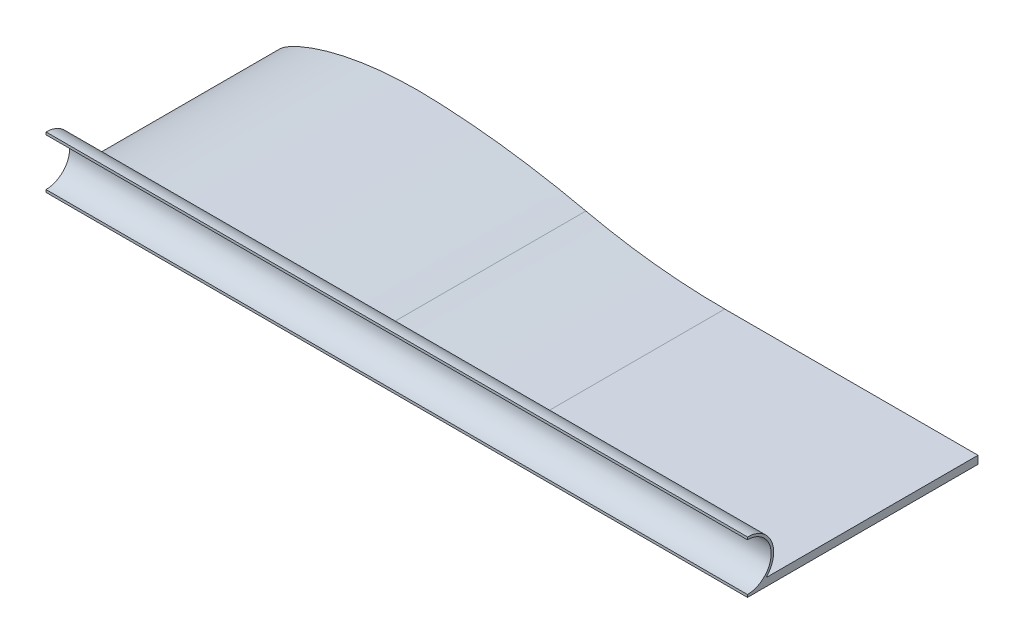
ISO-10303-21;
HEADER;
FILE_DESCRIPTION(('STEP AP214'),'2;1');
FILE_NAME('part.step','',(''),(''),'','','');
FILE_SCHEMA(('AUTOMOTIVE_DESIGN { 1 0 10303 214 1 1 1 1 }'));
ENDSEC;
DATA;
#1=APPLICATION_CONTEXT('core data for automotive mechanical design processes');
#2=APPLICATION_PROTOCOL_DEFINITION('international standard','automotive_design',2000,#1);
#3=PRODUCT_CONTEXT('',#1,'mechanical');
#4=PRODUCT('Part','Part','',(#3));
#5=PRODUCT_RELATED_PRODUCT_CATEGORY('part','',(#4));
#6=PRODUCT_DEFINITION_FORMATION('','',#4);
#7=PRODUCT_DEFINITION_CONTEXT('part definition',#1,'design');
#8=PRODUCT_DEFINITION('design','',#6,#7);
#9=PRODUCT_DEFINITION_SHAPE('','',#8);
#10=(LENGTH_UNIT() NAMED_UNIT(*) SI_UNIT(.MILLI.,.METRE.));
#11=(NAMED_UNIT(*) PLANE_ANGLE_UNIT() SI_UNIT($,.RADIAN.));
#12=(NAMED_UNIT(*) SI_UNIT($,.STERADIAN.) SOLID_ANGLE_UNIT());
#13=UNCERTAINTY_MEASURE_WITH_UNIT(LENGTH_MEASURE(1.E-05),#10,'distance_accuracy_value','');
#14=(GEOMETRIC_REPRESENTATION_CONTEXT(3) GLOBAL_UNCERTAINTY_ASSIGNED_CONTEXT((#13)) GLOBAL_UNIT_ASSIGNED_CONTEXT((#10,
#11,#12)) REPRESENTATION_CONTEXT('',''));
#15=CARTESIAN_POINT('',(0.,0.,0.));
#16=DIRECTION('',(0.,0.,1.));
#17=DIRECTION('',(1.,0.,0.));
#18=AXIS2_PLACEMENT_3D('',#15,#16,#17);
#19=CARTESIAN_POINT('',(0.,0.,185.42));
#20=DIRECTION('',(0.,0.,1.));
#21=DIRECTION('',(1.,0.,0.));
#22=AXIS2_PLACEMENT_3D('',#19,#20,#21);
#23=PLANE('',#22);
#24=DIRECTION('',(-1.,0.,0.));
#25=VECTOR('',#24,1.);
#26=CARTESIAN_POINT('',(563.88,36.4773533691905,185.42));
#27=LINE('',#26,#25);
#28=CARTESIAN_POINT('',(563.88,36.4773533691905,185.42));
#29=VERTEX_POINT('',#28);
#30=CARTESIAN_POINT('',(-0.366692026212409,36.4773533691905,185.42));
#31=VERTEX_POINT('',#30);
#32=EDGE_CURVE('E51',#29,#31,#27,.T.);
#33=ORIENTED_EDGE('',*,*,#32,.F.);
#34=DIRECTION('',(0.,1.,0.));
#35=VECTOR('',#34,1.);
#36=CARTESIAN_POINT('',(563.88,0.,185.42));
#37=LINE('',#36,#35);
#38=CARTESIAN_POINT('',(563.88,38.5093533691905,185.42));
#39=VERTEX_POINT('',#38);
#40=EDGE_CURVE('E174',#29,#39,#37,.T.);
#41=ORIENTED_EDGE('',*,*,#40,.T.);
#42=DIRECTION('',(-1.,0.,0.));
#43=VECTOR('',#42,1.);
#44=CARTESIAN_POINT('',(563.88,38.5093533691905,185.42));
#45=LINE('',#44,#43);
#46=CARTESIAN_POINT('',(-0.366692026212367,38.5093533691905,185.42));
#47=VERTEX_POINT('',#46);
#48=EDGE_CURVE('E210',#39,#47,#45,.T.);
#49=ORIENTED_EDGE('',*,*,#48,.T.);
#50=DIRECTION('',(0.,1.,0.));
#51=VECTOR('',#50,1.);
#52=CARTESIAN_POINT('',(-0.366692026212367,0.,185.42));
#53=LINE('',#52,#51);
#54=EDGE_CURVE('E221',#31,#47,#53,.T.);
#55=ORIENTED_EDGE('',*,*,#54,.F.);
#56=EDGE_LOOP('',(#33,#41,#49,#55));
#57=FACE_BOUND('',#56,.T.);
#58=ADVANCED_FACE('F35',(#57),#23,.T.);
#59=CARTESIAN_POINT('',(0.,2.69535336919036,185.42));
#60=DIRECTION('',(0.,-1.,0.));
#61=DIRECTION('',(1.,0.,0.));
#62=AXIS2_PLACEMENT_3D('',#59,#60,#61);
#63=PLANE('',#62);
#64=DIRECTION('',(-1.,0.,0.));
#65=VECTOR('',#64,1.);
#66=CARTESIAN_POINT('',(563.88,2.69535336919067,170.339585549462));
#67=LINE('',#66,#65);
#68=CARTESIAN_POINT('',(563.88,2.69535336919067,170.339585549462));
#69=VERTEX_POINT('',#68);
#70=CARTESIAN_POINT('',(360.180421151928,2.69535336919056,170.339585549462));
#71=VERTEX_POINT('',#70);
#72=EDGE_CURVE('E59',#69,#71,#67,.T.);
#73=ORIENTED_EDGE('',*,*,#72,.F.);
#74=DIRECTION('',(0.,0.,-1.));
#75=VECTOR('',#74,1.);
#76=CARTESIAN_POINT('',(563.88,2.69535336919067,185.42));
#77=LINE('',#76,#75);
#78=CARTESIAN_POINT('',(563.88,2.69535336919067,0.));
#79=VERTEX_POINT('',#78);
#80=EDGE_CURVE('E120',#69,#79,#77,.T.);
#81=ORIENTED_EDGE('',*,*,#80,.T.);
#82=DIRECTION('',(-1.,0.,0.));
#83=VECTOR('',#82,1.);
#84=CARTESIAN_POINT('',(0.,2.69535336919036,0.));
#85=LINE('',#84,#83);
#86=CARTESIAN_POINT('',(360.180421151928,2.69535336919056,0.));
#87=VERTEX_POINT('',#86);
#88=EDGE_CURVE('E112',#79,#87,#85,.T.);
#89=ORIENTED_EDGE('',*,*,#88,.T.);
#90=DIRECTION('',(0.,0.,1.));
#91=VECTOR('',#90,1.);
#92=CARTESIAN_POINT('',(360.180421151928,2.69535336919056,185.42));
#93=LINE('',#92,#91);
#94=EDGE_CURVE('E117',#87,#71,#93,.T.);
#95=ORIENTED_EDGE('',*,*,#94,.T.);
#96=EDGE_LOOP('',(#73,#81,#89,#95));
#97=FACE_BOUND('',#96,.T.);
#98=ADVANCED_FACE('F119',(#97),#63,.F.);
#99=CARTESIAN_POINT('',(304.8,0.,185.42));
#100=CARTESIAN_POINT('',(304.806765113415,0.0297936907438,185.42));
#101=CARTESIAN_POINT('',(303.042265442166,0.505757681104882,185.42));
#102=CARTESIAN_POINT('',(301.260699107524,1.13128828679422,185.42));
#103=CARTESIAN_POINT('',(296.859481645383,2.43138214292342,185.42));
#104=CARTESIAN_POINT('',(291.428347563501,4.05950750692163,185.42));
#105=CARTESIAN_POINT('',(284.271481229636,6.10623828707882,185.42));
#106=CARTESIAN_POINT('',(275.759062516084,8.44101190552645,185.42));
#107=CARTESIAN_POINT('',(265.867595029522,11.0139121726236,185.42));
#108=CARTESIAN_POINT('',(254.72828410266,13.7239516275996,185.42));
#109=CARTESIAN_POINT('',(242.45219776627,16.501342019607,185.42));
#110=CARTESIAN_POINT('',(229.161916522714,19.2494538440017,185.42));
#111=CARTESIAN_POINT('',(215.002240334106,21.8918598082205,185.42));
#112=CARTESIAN_POINT('',(200.122077246214,24.3476644337164,185.42));
#113=CARTESIAN_POINT('',(184.681833301631,26.5449418917091,185.42));
#114=CARTESIAN_POINT('',(168.851714947921,28.4233907056108,185.42));
#115=CARTESIAN_POINT('',(152.808183208541,29.930661937332,185.42));
#116=CARTESIAN_POINT('',(136.726583628561,31.0048710051825,185.42));
#117=CARTESIAN_POINT('',(120.705050439528,31.6889083800929,185.42));
#118=CARTESIAN_POINT('',(104.91367571592,31.6961733177902,185.42));
#119=CARTESIAN_POINT('',(89.5648924045714,30.8862286831657,185.42));
#120=CARTESIAN_POINT('',(74.9378034426248,29.3709102924395,185.42));
#121=CARTESIAN_POINT('',(61.2207309550213,27.2233169079844,185.42));
#122=CARTESIAN_POINT('',(48.5867513337238,24.5540455106148,185.42));
#123=CARTESIAN_POINT('',(37.1861333906392,21.5011014723962,185.42));
#124=CARTESIAN_POINT('',(27.1552746614983,18.1970778873359,185.42));
#125=CARTESIAN_POINT('',(18.5969283006425,14.8044671458805,185.42));
#126=CARTESIAN_POINT('',(11.6063717286755,11.4360388322654,185.42));
#127=CARTESIAN_POINT('',(6.20537461581932,8.26316028915888,185.42));
#128=CARTESIAN_POINT('',(2.4620711553724,5.3102193566351,185.42));
#129=CARTESIAN_POINT('',(0.172825892274397,2.71807809904705,185.42));
#130=CARTESIAN_POINT('',(-0.366692026212387,-0.106725709936372,185.42));
#131=CARTESIAN_POINT('',(1.61853864418734,-2.17519153343636,185.42));
#132=CARTESIAN_POINT('',(4.90312913802598,-3.1117877974165,185.42));
#133=CARTESIAN_POINT('',(9.54050066961738,-3.65904451106276,185.42));
#134=CARTESIAN_POINT('',(15.6223250235567,-3.68468011379504,185.42));
#135=CARTESIAN_POINT('',(23.0877165309997,-3.30949507157914,185.42));
#136=CARTESIAN_POINT('',(31.8617424793389,-2.56072504363965,185.42));
#137=CARTESIAN_POINT('',(41.8437098749915,-1.53618962834286,185.42));
#138=CARTESIAN_POINT('',(52.9319861205823,-0.324549042889645,185.42));
#139=CARTESIAN_POINT('',(65.0085126482625,0.982737612858198,185.42));
#140=CARTESIAN_POINT('',(77.9641225568185,2.27751163277432,185.42));
#141=CARTESIAN_POINT('',(91.6740314858693,3.44660128053989,185.42));
#142=CARTESIAN_POINT('',(106.020407657375,4.41212483885966,185.42));
#143=CARTESIAN_POINT('',(120.95534562256,5.05177624345621,185.42));
#144=CARTESIAN_POINT('',(136.33914130998,5.41029723383236,185.42));
#145=CARTESIAN_POINT('',(152.007716340095,5.72933017095042,185.42));
#146=CARTESIAN_POINT('',(167.715786189237,5.89135553497832,185.42));
#147=CARTESIAN_POINT('',(183.286749282816,5.90781947795733,185.42));
#148=CARTESIAN_POINT('',(198.553027184666,5.75950083301546,185.42));
#149=CARTESIAN_POINT('',(213.347799024157,5.45737661505621,185.42));
#150=CARTESIAN_POINT('',(227.508384673819,5.01338248731081,185.42));
#151=CARTESIAN_POINT('',(240.877077650288,4.45854649480439,185.42));
#152=CARTESIAN_POINT('',(253.302348041566,3.81956254234677,185.42));
#153=CARTESIAN_POINT('',(264.636493620716,3.14064435260617,185.42));
#154=CARTESIAN_POINT('',(274.759317931257,2.45167335072776,185.42));
#155=CARTESIAN_POINT('',(283.511762664263,1.80333800911344,185.42));
#156=CARTESIAN_POINT('',(290.902443864489,1.20739442477992,185.42));
#157=CARTESIAN_POINT('',(296.536660630331,0.742433739926797,185.42));
#158=CARTESIAN_POINT('',(301.097723541562,0.310240549260641,185.42));
#159=CARTESIAN_POINT('',(302.984341567181,0.206591885939164,185.42));
#160=CARTESIAN_POINT('',(304.793276654245,-0.0296097451566188,185.42));
#161=CARTESIAN_POINT('',(304.8,0.,185.42));
#162=B_SPLINE_CURVE_WITH_KNOTS('',3,(#99,#100,#101,#102,#103,#104,#105,#106,#107,#108,#109,#110,
#111,#112,#113,#114,#115,#116,#117,#118,#119,#120,#121,#122,#123,#124,#125,#126,#127,#128,#129,
#130,#131,#132,#133,#134,#135,#136,#137,#138,#139,#140,#141,#142,#143,#144,#145,#146,#147,#148,
#149,#150,#151,#152,#153,#154,#155,#156,#157,#158,#159,#160,#161),.UNSPECIFIED.,.T.,.F.,(4,1,1,
1,1,1,1,1,1,1,1,1,1,1,1,1,1,1,1,1,1,1,1,1,1,1,1,1,1,1,1,1,1,1,1,1,1,1,1,1,1,1,1,1,1,1,1,1,1,1,1,
1,1,1,1,1,1,1,1,1,4),(0.,0.00137455348322331,0.00548449728179396,0.0122733609908927,
0.021682195504866,0.0335806119079948,0.0478307427867091,0.0643059527211734,0.082777332043007,
0.103063756455997,0.124929016786915,0.148149110667858,0.172444694611559,0.197572105868171,
0.223268880537162,0.249227774933554,0.275186209349679,0.300900708934774,0.326462938278696,
0.351222485186767,0.374905858971967,0.397269706218861,0.418072413969665,0.437079533175026,
0.454093093767394,0.468919631578705,0.48139171235289,0.491447126518173,0.499023571234557,
0.504293734329401,0.507921918342,0.511539686153778,0.516780527527172,0.524216490268905,
0.533991629403711,0.546033957270731,0.560220284382465,0.576403357410148,0.594370816485922,
0.613951103581465,0.634916884969972,0.657088503485648,0.680229909573905,0.704175481107386,
0.72909036740664,0.754353775526935,0.779667752347888,0.804760119952374,0.829359338708984,
0.853208710008459,0.876041363199166,0.897604065496152,0.917662212410958,0.935969860405553,
0.952309787739252,0.966502759006892,0.978350082728452,0.987731492337842,0.994510920242662,
0.998633932979557,1.),.UNSPECIFIED.);
#163=DIRECTION('',(0.,0.,-1.));
#164=VECTOR('',#163,1.);
#165=SURFACE_OF_LINEAR_EXTRUSION('',#162,#164);
#166=CARTESIAN_POINT('',(248.468052168918,15.1306788652424,164.463473326362));
#167=CARTESIAN_POINT('',(247.099112764868,15.4393030736697,164.429668740607));
#168=CARTESIAN_POINT('',(245.729105769636,15.7439384634841,164.403164041799));
#169=CARTESIAN_POINT('',(242.98715958145,16.3451319217436,164.363636037673));
#170=CARTESIAN_POINT('',(241.615220436294,16.6416901864393,164.35061240452));
#171=CARTESIAN_POINT('',(238.869528993161,17.2266484245325,164.336926529534));
#172=CARTESIAN_POINT('',(237.495776672501,17.5150482948292,164.33626444385));
#173=CARTESIAN_POINT('',(234.746598439609,18.0837493381834,164.346301754495));
#174=CARTESIAN_POINT('',(233.371172479316,18.3640502726612,164.357001485173));
#175=CARTESIAN_POINT('',(230.618784230446,18.9165921609464,164.388845334103));
#176=CARTESIAN_POINT('',(229.241821898425,19.1888328805205,164.409989755566));
#177=CARTESIAN_POINT('',(226.478603793566,19.726789216564,164.462024055523));
#178=CARTESIAN_POINT('',(225.092340035387,19.9924584219975,164.492969163741));
#179=CARTESIAN_POINT('',(222.318490622957,20.5155577262323,164.563744839146));
#180=CARTESIAN_POINT('',(220.930904972023,20.7729878456534,164.603575384095));
#181=CARTESIAN_POINT('',(218.154524449685,21.279539448282,164.6913373582));
#182=CARTESIAN_POINT('',(216.765729621149,21.5286612146448,164.739268510944));
#183=CARTESIAN_POINT('',(213.987042349249,22.0185235511418,164.842475082088));
#184=CARTESIAN_POINT('',(212.597149995387,22.2592647444273,164.897749952956));
#185=CARTESIAN_POINT('',(209.816387956572,22.7323048063502,165.014913115282));
#186=CARTESIAN_POINT('',(208.425518412209,22.9646047056129,165.076800595724));
#187=CARTESIAN_POINT('',(203.687559953126,23.7412065742073,165.297593043582));
#188=CARTESIAN_POINT('',(200.337783470008,24.2652725829202,165.470632687059));
#189=CARTESIAN_POINT('',(193.632531070931,25.2637601399537,165.841313314402));
#190=CARTESIAN_POINT('',(190.277055644423,25.7381857522015,166.038952281482));
#191=CARTESIAN_POINT('',(183.55969327915,26.6370163802038,166.449579205512));
#192=CARTESIAN_POINT('',(180.197805254594,27.0614119848388,166.662570038189));
#193=CARTESIAN_POINT('',(175.150007571335,27.6597382817842,166.986320969196));
#194=CARTESIAN_POINT('',(173.466212297941,27.8528405361224,167.094972932367));
#195=CARTESIAN_POINT('',(170.097202157144,28.2261269124826,167.312436529626));
#196=CARTESIAN_POINT('',(168.411987294754,28.4063110799215,167.421248163152));
#197=CARTESIAN_POINT('',(165.038988742322,28.7536321459034,167.637760776665));
#198=CARTESIAN_POINT('',(163.351204086191,28.9207601574536,167.745460957575));
#199=CARTESIAN_POINT('',(159.974167283474,29.2413958652269,167.958151865315));
#200=CARTESIAN_POINT('',(158.284915137895,29.3949035707931,168.063142594003));
#201=CARTESIAN_POINT('',(155.749114612675,29.6147238866364,168.217478258039));
#202=CARTESIAN_POINT('',(154.903116246131,29.6862893189844,168.268422371533));
#203=CARTESIAN_POINT('',(153.21074882911,29.8258455257352,168.369031887208));
#204=CARTESIAN_POINT('',(152.364379778719,29.8938363009836,168.418697289692));
#205=CARTESIAN_POINT('',(149.824732837902,30.0924564399681,168.565533853266));
#206=CARTESIAN_POINT('',(148.130908282538,30.217734213109,168.660545791737));
#207=CARTESIAN_POINT('',(144.751165423032,30.4538681438089,168.843425691181));
#208=CARTESIAN_POINT('',(143.06525429601,30.5647991228659,168.931329738892));
#209=CARTESIAN_POINT('',(140.535497050165,30.7213018720438,169.057660941176));
#210=CARTESIAN_POINT('',(139.692091942403,30.7718207322848,169.098850724682));
#211=CARTESIAN_POINT('',(138.005003288557,30.8696319326728,169.179313659566));
#212=CARTESIAN_POINT('',(137.16131974225,30.9169242702306,169.218586809405));
#213=CARTESIAN_POINT('',(134.629336651477,31.0539885921684,169.33336991774));
#214=CARTESIAN_POINT('',(132.940628434751,31.1389155038115,169.405817240403));
#215=CARTESIAN_POINT('',(129.562002759082,31.2926329082601,169.538717575606));
#216=CARTESIAN_POINT('',(127.872085310089,31.3614235323552,169.599170685735));
#217=CARTESIAN_POINT('',(124.492561356265,31.4797032865283,169.704133434236));
#218=CARTESIAN_POINT('',(122.802955914516,31.5292095492614,169.748657221691));
#219=CARTESIAN_POINT('',(119.422806870303,31.6058021333441,169.81791558745));
#220=CARTESIAN_POINT('',(117.732263265494,31.6328883983902,169.842650116058));
#221=CARTESIAN_POINT('',(114.352868206746,31.6624941981848,169.869695739275));
#222=CARTESIAN_POINT('',(112.664017291008,31.6650445138588,169.872034929345));
#223=CARTESIAN_POINT('',(110.130998580961,31.6489812960982,169.857352105301));
#224=CARTESIAN_POINT('',(109.286699683129,31.6403120582082,169.849425849954));
#225=CARTESIAN_POINT('',(107.598278875748,31.6160959896816,169.82735450368));
#226=CARTESIAN_POINT('',(106.754156965983,31.6005491674758,169.813209420376));
#227=CARTESIAN_POINT('',(105.066857319237,31.5623127168629,169.778570658565));
#228=CARTESIAN_POINT('',(104.223679356716,31.539628617495,169.758081894516));
#229=CARTESIAN_POINT('',(102.537728038672,31.4870156943165,169.710835411807));
#230=CARTESIAN_POINT('',(101.694954683541,31.4570868635057,169.684077687088));
#231=CARTESIAN_POINT('',(99.1673713849659,31.3565071872927,169.594780882425));
#232=CARTESIAN_POINT('',(97.4832919611124,31.2750630163878,169.523218040631));
#233=CARTESIAN_POINT('',(94.1183585925358,31.0836100831493,169.35845392984));
#234=CARTESIAN_POINT('',(92.4375038113014,30.9736101633811,169.265259360262));
#235=CARTESIAN_POINT('',(89.9186814430678,30.7873667410832,169.111498764609));
#236=CARTESIAN_POINT('',(89.0794823738536,30.7217448660811,169.057916994949));
#237=CARTESIAN_POINT('',(87.4019551735337,30.5833984812169,168.946472774694));
#238=CARTESIAN_POINT('',(86.5636270399081,30.5106739919627,168.888610336518));
#239=CARTESIAN_POINT('',(84.5125395286149,30.3238253765823,168.742126412014));
#240=CARTESIAN_POINT('',(83.300292553447,30.2057504219419,168.651338195102));
#241=CARTESIAN_POINT('',(80.8779681136541,29.9542293572308,168.462617679754));
#242=CARTESIAN_POINT('',(79.6678906260262,29.820783411128,168.364685457529));
#243=CARTESIAN_POINT('',(77.2492648956322,29.538148235342,168.162840751385));
#244=CARTESIAN_POINT('',(76.0407181773335,29.3889487327805,168.05892438554));
#245=CARTESIAN_POINT('',(73.6261031432444,29.0745987726491,167.846486256115));
#246=CARTESIAN_POINT('',(72.4200348352411,28.9094482650402,167.737964478089));
#247=CARTESIAN_POINT('',(70.0097790841528,28.5627712330388,167.517614596735));
#248=CARTESIAN_POINT('',(68.8055932920855,28.3812345173675,167.40578446527));
#249=CARTESIAN_POINT('',(66.4000128898155,28.0015463227217,167.180320275443));
#250=CARTESIAN_POINT('',(65.1986182783616,27.8033948511975,167.066686217889));
#251=CARTESIAN_POINT('',(62.7980243609987,27.3900185139854,166.83904908426));
#252=CARTESIAN_POINT('',(61.5988268939974,27.1747830659961,166.725045822086));
#253=CARTESIAN_POINT('',(59.2035470578319,26.7269953655757,166.498309512095));
#254=CARTESIAN_POINT('',(58.0074646870571,26.4944431220997,166.38557646362));
#255=CARTESIAN_POINT('',(55.6191680500763,26.0116865837848,166.163038562305));
#256=CARTESIAN_POINT('',(54.4269522573869,25.7614904596865,166.053232386098));
#257=CARTESIAN_POINT('',(52.0460652405985,25.2428909182492,165.838200181499));
#258=CARTESIAN_POINT('',(50.8573940253222,24.9744874556303,165.732974164499));
#259=CARTESIAN_POINT('',(48.4842374396223,24.4191694851609,165.528978599686));
#260=CARTESIAN_POINT('',(47.2997508182626,24.1322611099859,165.430206934475));
#261=CARTESIAN_POINT('',(44.9349623602512,23.5391022201878,165.240946806169));
#262=CARTESIAN_POINT('',(43.7546605023358,23.2328518039957,165.150458300927));
#263=CARTESIAN_POINT('',(41.3997891521501,22.6002912901054,164.979876614747));
#264=CARTESIAN_POINT('',(40.2252155520477,22.2739989548517,164.899774419235));
#265=CARTESIAN_POINT('',(37.8813221161378,21.600223622063,164.752226964184));
#266=CARTESIAN_POINT('',(36.7120023783764,21.2527402308151,164.6847819399));
#267=CARTESIAN_POINT('',(34.3801580163431,20.5357940626242,164.565256152798));
#268=CARTESIAN_POINT('',(33.2176294378958,20.1663458527597,164.513165340685));
#269=CARTESIAN_POINT('',(30.8996287895612,19.404004831948,164.427364517488));
#270=CARTESIAN_POINT('',(29.7441562812155,19.01111349442,164.393653352576));
#271=CARTESIAN_POINT('',(28.1609204401574,18.4539310867095,164.362460096624));
#272=CARTESIAN_POINT('',(27.7296000620791,18.3002031326191,164.355502473057));
#273=CARTESIAN_POINT('',(26.8681875897166,17.989244063449,164.344914996749));
#274=CARTESIAN_POINT('',(26.4380954830241,17.8320129839008,164.341285110271));
#275=CARTESIAN_POINT('',(25.1497543288988,17.354824429511,164.33572157918));
#276=CARTESIAN_POINT('',(24.2934918443473,17.0293896905393,164.339115128304));
#277=CARTESIAN_POINT('',(22.5873162475749,16.3623211828128,164.362273846854));
#278=CARTESIAN_POINT('',(21.7374043476761,16.0206844081607,164.382042065496));
#279=CARTESIAN_POINT('',(20.0485993198675,15.3211554943387,164.440548870754));
#280=CARTESIAN_POINT('',(19.2096771328309,14.9633278799426,164.479217298816));
#281=CARTESIAN_POINT('',(17.5413803292654,14.2290996288062,164.578711308347));
#282=CARTESIAN_POINT('',(16.7120044092438,13.8527015657745,164.63953382686));
#283=CARTESIAN_POINT('',(15.4770548516788,13.2728584375628,164.750469818921));
#284=CARTESIAN_POINT('',(15.0669817171657,13.0770653141352,164.790725061056));
#285=CARTESIAN_POINT('',(14.250182276954,12.6801754106815,164.878423500939));
#286=CARTESIAN_POINT('',(13.8434558926797,12.4790787556418,164.925866529419));
#287=CARTESIAN_POINT('',(13.1618635311059,12.1359258965832,165.01235069137));
#288=CARTESIAN_POINT('',(12.885998123701,11.9953231791055,165.049299980608));
#289=CARTESIAN_POINT('',(12.3361588638037,11.7115201712526,165.127104041147));
#290=CARTESIAN_POINT('',(12.0621850057737,11.5683198884863,165.16795880101));
#291=CARTESIAN_POINT('',(11.5162324517022,11.2792992293422,165.253818293065));
#292=CARTESIAN_POINT('',(11.24425400004,11.1334785393424,165.298823524705));
#293=CARTESIAN_POINT('',(10.7025445289812,10.8391217502227,165.393272053752));
#294=CARTESIAN_POINT('',(10.4328135048426,10.6905856568341,165.442715341794));
#295=CARTESIAN_POINT('',(9.89443079653861,10.389493699878,165.54678230963));
#296=CARTESIAN_POINT('',(9.62579511819272,10.2369191590806,165.601435099356));
#297=CARTESIAN_POINT('',(9.09170217803851,9.928292515259,165.716145557155));
#298=CARTESIAN_POINT('',(8.826244959083,9.77224036542968,165.776203298007));
#299=CARTESIAN_POINT('',(8.03551661859129,9.29848842238934,165.965227679485));
#300=CARTESIAN_POINT('',(7.51567311909627,8.97507343409861,166.103086213979));
#301=CARTESIAN_POINT('',(6.74618793467798,8.47471203433791,166.332433553928));
#302=CARTESIAN_POINT('',(6.48935400991805,8.30392732035346,166.413398369822));
#303=CARTESIAN_POINT('',(5.98126251790896,7.95799049619306,166.583357898655));
#304=CARTESIAN_POINT('',(5.73000576717783,7.78283775438987,166.672353777835));
#305=CARTESIAN_POINT('',(5.23389430851345,7.42794718844956,166.859212423624));
#306=CARTESIAN_POINT('',(4.98904274618852,7.24820719403071,166.957079445315));
#307=CARTESIAN_POINT('',(4.50675956736187,6.88376943012572,167.162744184339));
#308=CARTESIAN_POINT('',(4.26933780828722,6.69906563224829,167.270554402962));
#309=CARTESIAN_POINT('',(3.80583756671004,6.326882633471,167.495795868893));
#310=CARTESIAN_POINT('',(3.57966778894605,6.13945125631728,167.61311722718));
#311=CARTESIAN_POINT('',(3.24794326035298,5.85511898544089,167.797659816609));
#312=CARTESIAN_POINT('',(3.13862221242216,5.75980956689629,167.860601553839));
#313=CARTESIAN_POINT('',(2.92263148581446,5.56818930774728,167.989443986426));
#314=CARTESIAN_POINT('',(2.81596176905235,5.47187848155587,168.05534463924));
#315=CARTESIAN_POINT('',(2.60556685321821,5.27847494681228,168.19010307957));
#316=CARTESIAN_POINT('',(2.50183770310351,5.18138353671228,168.258956553021));
#317=CARTESIAN_POINT('',(2.34844564133821,5.03512951162349,168.364586533558));
#318=CARTESIAN_POINT('',(2.29767932398624,4.98627280352114,168.400190061589));
#319=CARTESIAN_POINT('',(2.19688609355388,4.88837669755038,168.472183638914));
#320=CARTESIAN_POINT('',(2.14685918284741,4.83933729909606,168.508573690733));
#321=CARTESIAN_POINT('',(1.99817777656258,4.6920338715069,168.618886624476));
#322=CARTESIAN_POINT('',(1.90076779766081,4.59343755753506,168.694058370917));
#323=CARTESIAN_POINT('',(1.71034712965602,4.39500542605915,168.848204538235));
#324=CARTESIAN_POINT('',(1.6173355890818,4.29516985322029,168.927178217093));
#325=CARTESIAN_POINT('',(1.44202770119231,4.09999093909481,169.084550688997));
#326=CARTESIAN_POINT('',(1.35942295420129,4.00473072430495,169.162707724787));
#327=CARTESIAN_POINT('',(1.19979679092124,3.8129441979615,169.322975614529));
#328=CARTESIAN_POINT('',(1.12277308712721,3.71641842450084,169.405084825371));
#329=CARTESIAN_POINT('',(0.97498835906888,3.5222084890532,169.573417546432));
#330=CARTESIAN_POINT('',(0.904225809227989,3.42452461586035,169.659640046493));
#331=CARTESIAN_POINT('',(0.769505004831324,3.22822834840215,169.836258445849));
#332=CARTESIAN_POINT('',(0.70554686588988,3.12961593839092,169.926654416018));
#333=CARTESIAN_POINT('',(0.584799155006636,2.93178923530164,170.111581332474));
#334=CARTESIAN_POINT('',(0.528012402751212,2.8325747214546,170.206113885656));
#335=CARTESIAN_POINT('',(0.421821123165149,2.63400755968544,170.39912074589));
#336=CARTESIAN_POINT('',(0.372417355181942,2.53465489861394,170.497595457077));
#337=CARTESIAN_POINT('',(0.280811795321136,2.33596262664607,170.698563862677));
#338=CARTESIAN_POINT('',(0.238634506137595,2.23662415843623,170.801069835946));
#339=CARTESIAN_POINT('',(0.1615406261027,2.03874822267569,171.009510495965));
#340=CARTESIAN_POINT('',(0.126623554506076,1.94021070250456,171.115444955155));
#341=CARTESIAN_POINT('',(0.0641246243949035,1.74429929101031,171.330511111542));
#342=CARTESIAN_POINT('',(0.0365428870408259,1.64692541893297,171.439642861517));
#343=CARTESIAN_POINT('',(-0.0110926307981346,1.45380372790455,171.660713969421));
#344=CARTESIAN_POINT('',(-0.031155345836698,1.35805410897489,171.772649825446));
#345=CARTESIAN_POINT('',(-0.0635541480619947,1.16839232323753,171.999168086046));
#346=CARTESIAN_POINT('',(-0.075890339593656,1.07448013163238,172.113750454857));
#347=CARTESIAN_POINT('',(-0.0925262154392856,0.888799221709953,172.345254480994));
#348=CARTESIAN_POINT('',(-0.0968244622715552,0.797030889691287,172.462176552968));
#349=CARTESIAN_POINT('',(-0.0970076141119342,0.615110229141666,172.699083157465));
#350=CARTESIAN_POINT('',(-0.0928109113632614,0.524982048214057,172.819086356434));
#351=CARTESIAN_POINT('',(-0.0753832280683874,0.347615393262595,173.060562208992));
#352=CARTESIAN_POINT('',(-0.0621537303654157,0.260376447399921,173.182034618178));
#353=CARTESIAN_POINT('',(-0.0351654961132611,0.131987647686504,173.364851757022));
#354=CARTESIAN_POINT('',(-0.0249813789988689,0.0896108386761541,173.425880515429));
#355=CARTESIAN_POINT('',(-0.00213614413360027,0.0057163934394097,173.548067604558));
#356=CARTESIAN_POINT('',(0.0105249422368201,-0.0358012536642464,173.609225933627));
#357=CARTESIAN_POINT('',(0.0382925783428243,-0.118051131850746,173.731759531452));
#358=CARTESIAN_POINT('',(0.0534055809803821,-0.158780964062048,173.793134942807));
#359=CARTESIAN_POINT('',(0.085886199438127,-0.239324829867683,173.915887893186));
#360=CARTESIAN_POINT('',(0.103253867741629,-0.279138842118476,173.977265432225));
#361=CARTESIAN_POINT('',(0.158549826668749,-0.397232466285488,174.161397483061));
#362=CARTESIAN_POINT('',(0.199658627387618,-0.47412753746641,174.284097555631));
#363=CARTESIAN_POINT('',(0.289292994632131,-0.624214718668818,174.529074165948));
#364=CARTESIAN_POINT('',(0.337821044255168,-0.697405577996537,174.651350547829));
#365=CARTESIAN_POINT('',(0.461593745975119,-0.868015119100685,174.942937936965));
#366=CARTESIAN_POINT('',(0.539869537407885,-0.963729046545386,175.111962906715));
#367=CARTESIAN_POINT('',(0.706950522773116,-1.14834321627522,175.448487140709));
#368=CARTESIAN_POINT('',(0.795756754950089,-1.23724278527642,175.615986252756));
#369=CARTESIAN_POINT('',(0.982481247839371,-1.40855811650258,175.949293963909));
#370=CARTESIAN_POINT('',(1.08040255122396,-1.49097169659674,176.115101977874));
#371=CARTESIAN_POINT('',(1.23338377864264,-1.60983788822823,176.36216273896));
#372=CARTESIAN_POINT('',(1.28536954599628,-1.64865135165099,176.444204926513));
#373=CARTESIAN_POINT('',(1.39134079918332,-1.72473363553984,176.607712011469));
#374=CARTESIAN_POINT('',(1.44532628136464,-1.76200245882665,176.689176909927));
#375=CARTESIAN_POINT('',(1.61026984320773,-1.8714712308803,176.932497302772));
#376=CARTESIAN_POINT('',(1.72426092139217,-1.94136911959916,177.093352759932));
#377=CARTESIAN_POINT('',(1.96069508551744,-2.07500071725246,177.411338798496));
#378=CARTESIAN_POINT('',(2.083137020581,-2.13873526271243,177.568469883201));
#379=CARTESIAN_POINT('',(2.32025205095482,-2.25223508417777,177.857893625309));
#380=CARTESIAN_POINT('',(2.43386905434918,-2.30273959941294,177.990761909506));
#381=CARTESIAN_POINT('',(2.66768414890197,-2.39923927597114,178.252268567558));
#382=CARTESIAN_POINT('',(2.78788184882412,-2.44523470491612,178.38090719215));
#383=CARTESIAN_POINT('',(3.03456055177293,-2.53287975373869,178.633419172185));
#384=CARTESIAN_POINT('',(3.16103841104493,-2.5745315162542,178.757294857863));
#385=CARTESIAN_POINT('',(3.41984347351225,-2.65384408897626,179.000296883102));
#386=CARTESIAN_POINT('',(3.55217482347974,-2.69150200352541,179.119419738211));
#387=CARTESIAN_POINT('',(3.82163818639287,-2.76325838874341,179.353294558613));
#388=CARTESIAN_POINT('',(3.95877186707272,-2.79735560616593,179.468044975988));
#389=CARTESIAN_POINT('',(4.16693383341922,-2.84629242618602,179.637831829911));
#390=CARTESIAN_POINT('',(4.23675026294066,-2.86224047314785,179.694052270696));
#391=CARTESIAN_POINT('',(4.37693713690766,-2.8934952560795,179.805980419598));
#392=CARTESIAN_POINT('',(4.44730758933415,-2.90880198279068,179.861688120305));
#393=CARTESIAN_POINT('',(4.64334238116614,-2.9505573488295,180.016116888725));
#394=CARTESIAN_POINT('',(4.76937397428675,-2.97639608532443,180.114537228855));
#395=CARTESIAN_POINT('',(5.02256434886443,-3.02631579415246,180.310366041634));
#396=CARTESIAN_POINT('',(5.14972312819733,-3.05039676979727,180.407774516189));
#397=CARTESIAN_POINT('',(5.53279106791516,-3.12006310644459,180.698341419127));
#398=CARTESIAN_POINT('',(5.790379670376,-3.16309052685403,180.889910630396));
#399=CARTESIAN_POINT('',(6.30997439871545,-3.24269891230238,181.268249058845));
#400=CARTESIAN_POINT('',(6.57197987813505,-3.27928081189211,181.455018968527));
#401=CARTESIAN_POINT('',(7.10044914701485,-3.34644243290488,181.823445181193));
#402=CARTESIAN_POINT('',(7.36691438736384,-3.37702015812236,182.005099766352));
#403=CARTESIAN_POINT('',(7.90402602482706,-3.43262322818156,182.363051603404));
#404=CARTESIAN_POINT('',(8.17467282746778,-3.4576480308414,182.539348330712));
#405=CARTESIAN_POINT('',(8.58335651533537,-3.49139556663474,182.800011773121));
#406=CARTESIAN_POINT('',(8.72003899141653,-3.50201328127738,182.886270738283));
#407=CARTESIAN_POINT('',(8.99416035049261,-3.5220571858299,183.057719072484));
#408=CARTESIAN_POINT('',(9.13159923533212,-3.53148337283277,183.142908438914));
#409=CARTESIAN_POINT('',(9.50946697859557,-3.5557721782054,183.375207206998));
#410=CARTESIAN_POINT('',(9.75058486872096,-3.56947377520389,183.521320348111));
#411=CARTESIAN_POINT('',(10.2349237558057,-3.5935993442244,183.81025096945));
#412=CARTESIAN_POINT('',(10.4781445908338,-3.60402356634223,183.953068700378));
#413=CARTESIAN_POINT('',(10.9666127348185,-3.62179657014416,184.235110426725));
#414=CARTESIAN_POINT('',(11.2118589774742,-3.62914687648484,184.374336171532));
#415=CARTESIAN_POINT('',(11.7045365353577,-3.64099172573236,184.648990761925));
#416=CARTESIAN_POINT('',(11.9519678624463,-3.64548625312816,184.784419586883));
#417=CARTESIAN_POINT('',(12.5021094624565,-3.65252100298116,185.079666733191));
#418=CARTESIAN_POINT('',(12.8053472639073,-3.6544394144983,185.238521683802));
#419=CARTESIAN_POINT('',(13.1272001630875,-3.65464133877353,185.402734578045));
#420=CARTESIAN_POINT('',(13.1441551329697,-3.65464663536669,185.411372397385));
#421=CARTESIAN_POINT('',(13.1611152527334,-3.65464663080947,185.42));
#422=B_SPLINE_CURVE_WITH_KNOTS('',3,(#166,#167,#168,#169,#170,#171,#172,#173,#174,#175,#176,
#177,#178,#179,#180,#181,#182,#183,#184,#185,#186,#187,#188,#189,#190,#191,#192,#193,#194,#195,
#196,#197,#198,#199,#200,#201,#202,#203,#204,#205,#206,#207,#208,#209,#210,#211,#212,#213,#214,
#215,#216,#217,#218,#219,#220,#221,#222,#223,#224,#225,#226,#227,#228,#229,#230,#231,#232,#233,
#234,#235,#236,#237,#238,#239,#240,#241,#242,#243,#244,#245,#246,#247,#248,#249,#250,#251,#252,
#253,#254,#255,#256,#257,#258,#259,#260,#261,#262,#263,#264,#265,#266,#267,#268,#269,#270,#271,
#272,#273,#274,#275,#276,#277,#278,#279,#280,#281,#282,#283,#284,#285,#286,#287,#288,#289,#290,
#291,#292,#293,#294,#295,#296,#297,#298,#299,#300,#301,#302,#303,#304,#305,#306,#307,#308,#309,
#310,#311,#312,#313,#314,#315,#316,#317,#318,#319,#320,#321,#322,#323,#324,#325,#326,#327,#328,
#329,#330,#331,#332,#333,#334,#335,#336,#337,#338,#339,#340,#341,#342,#343,#344,#345,#346,#347,
#348,#349,#350,#351,#352,#353,#354,#355,#356,#357,#358,#359,#360,#361,#362,#363,#364,#365,#366,
#367,#368,#369,#370,#371,#372,#373,#374,#375,#376,#377,#378,#379,#380,#381,#382,#383,#384,#385,
#386,#387,#388,#389,#390,#391,#392,#393,#394,#395,#396,#397,#398,#399,#400,#401,#402,#403,#404,
#405,#406,#407,#408,#409,#410,#411,#412,#413,#414,#415,#416,#417,#418,#419,#420,#421),
.UNSPECIFIED.,.F.,.F.,(4,2,2,2,2,2,2,2,2,2,2,2,2,2,2,2,2,2,2,2,2,2,2,2,2,2,2,2,2,2,2,2,2,2,2,2,
2,2,2,2,2,2,2,2,2,2,2,2,2,2,2,2,2,2,2,2,2,2,2,2,2,2,2,2,2,2,2,2,2,2,2,2,2,2,2,2,2,2,2,2,2,2,2,2,
2,2,2,2,2,2,2,2,2,2,2,2,2,2,2,2,2,2,2,2,2,2,2,2,2,2,2,2,2,2,2,2,2,2,2,2,2,2,2,2,2,2,2,4),(0.,
4.21107196657604,8.42204152496658,12.6330642752375,16.844210948221,21.0554798790546,
25.2909159363535,29.5263413929243,33.7616223549788,37.9965877201135,42.231034275117,
52.4152890365646,62.5987093867124,72.7840422884685,77.878935608084,82.9738110143555,
88.0721246909436,93.170434870251,95.7220684435024,98.2737014130624,103.376946611156,
108.452400715269,110.990153429739,113.52790818074,118.604993946651,123.68203840245,
128.754561955354,133.827098246887,138.89327009129,141.426369647158,143.959466097852,
146.490605044483,149.021746436819,154.084010475146,159.144708800182,161.675067507208,
164.205418872772,167.869379674012,171.53330139408,175.199627284818,178.865964677377,
182.534598242652,186.203230162895,189.874152543286,193.545073025313,197.214304557455,
200.883545214981,204.551576043783,208.219588207596,211.884395179652,215.549270261662,
219.211741338051,222.873982467217,224.247809803194,225.621623211022,228.369413445597,
231.117715476074,233.855892269129,236.593690634036,237.962200670751,239.330678485075,
240.266123616216,241.201566007663,242.137121112675,243.072674243251,244.013801456871,
244.95494134476,246.836471741948,247.792978518161,248.749624418846,249.706731631729,
250.665059032488,251.613567897621,252.087833365876,252.562092017569,253.035679929411,
253.272498433759,253.509317698268,253.982241226785,254.455072826502,254.899965857503,
255.344675496228,255.789276478032,256.233885012884,256.678667820735,257.123496343511,
257.569804507921,258.016083110006,258.462369082985,258.908123058026,259.353871013131,
259.799698676832,260.249829561078,260.699886568623,260.924829203566,261.149768988919,
261.375310666568,261.600857595239,262.052149246741,262.503592269929,263.13138993178,
263.759249542632,264.387319494014,264.701074984812,265.014829902627,265.642057183642,
266.269199213811,266.814896946647,267.360562271757,267.905957145805,268.451744782178,
268.997723874644,269.270858518175,269.543997103551,270.029925767188,270.515853515287,
271.487368840202,272.458743186761,273.430439940982,274.402231529008,274.888143746732,
275.374057149935,276.220809824391,277.06749786763,277.913765455644,278.760037640086,
279.786922548081,279.844007961303),.UNSPECIFIED.);
#423=CARTESIAN_POINT('',(248.468052126158,15.1306788748815,164.463473325305));
#424=VERTEX_POINT('',#423);
#425=CARTESIAN_POINT('',(13.1611152527335,-3.65464663080947,185.42));
#426=VERTEX_POINT('',#425);
#427=EDGE_CURVE('E146',#424,#426,#422,.T.);
#428=ORIENTED_EDGE('',*,*,#427,.F.);
#429=DIRECTION('',(0.,0.,-1.));
#430=VECTOR('',#429,1.);
#431=CARTESIAN_POINT('',(248.468052126158,15.1306788748816,185.42));
#432=LINE('',#431,#430);
#433=CARTESIAN_POINT('',(248.468052126158,15.1306788748816,0.));
#434=VERTEX_POINT('',#433);
#435=EDGE_CURVE('E124',#424,#434,#432,.T.);
#436=ORIENTED_EDGE('',*,*,#435,.T.);
#437=CARTESIAN_POINT('',(304.8,0.,0.));
#438=CARTESIAN_POINT('',(304.806765113415,0.0297936907438,0.));
#439=CARTESIAN_POINT('',(303.042265442166,0.505757681104882,0.));
#440=CARTESIAN_POINT('',(301.260699107524,1.13128828679422,0.));
#441=CARTESIAN_POINT('',(296.859481645383,2.43138214292342,0.));
#442=CARTESIAN_POINT('',(291.428347563501,4.05950750692163,0.));
#443=CARTESIAN_POINT('',(284.271481229636,6.10623828707882,0.));
#444=CARTESIAN_POINT('',(275.759062516084,8.44101190552645,0.));
#445=CARTESIAN_POINT('',(265.867595029522,11.0139121726236,0.));
#446=CARTESIAN_POINT('',(254.72828410266,13.7239516275996,0.));
#447=CARTESIAN_POINT('',(242.45219776627,16.501342019607,0.));
#448=CARTESIAN_POINT('',(229.161916522714,19.2494538440017,0.));
#449=CARTESIAN_POINT('',(215.002240334106,21.8918598082205,0.));
#450=CARTESIAN_POINT('',(200.122077246214,24.3476644337164,0.));
#451=CARTESIAN_POINT('',(184.681833301631,26.5449418917091,0.));
#452=CARTESIAN_POINT('',(168.851714947921,28.4233907056108,0.));
#453=CARTESIAN_POINT('',(152.808183208541,29.930661937332,0.));
#454=CARTESIAN_POINT('',(136.726583628561,31.0048710051825,0.));
#455=CARTESIAN_POINT('',(120.705050439528,31.6889083800929,0.));
#456=CARTESIAN_POINT('',(104.91367571592,31.6961733177902,0.));
#457=CARTESIAN_POINT('',(89.5648924045714,30.8862286831657,0.));
#458=CARTESIAN_POINT('',(74.9378034426248,29.3709102924395,0.));
#459=CARTESIAN_POINT('',(61.2207309550213,27.2233169079844,0.));
#460=CARTESIAN_POINT('',(48.5867513337238,24.5540455106148,0.));
#461=CARTESIAN_POINT('',(37.1861333906392,21.5011014723962,0.));
#462=CARTESIAN_POINT('',(27.1552746614983,18.1970778873359,0.));
#463=CARTESIAN_POINT('',(18.5969283006425,14.8044671458805,0.));
#464=CARTESIAN_POINT('',(11.6063717286755,11.4360388322654,0.));
#465=CARTESIAN_POINT('',(6.20537461581932,8.26316028915888,0.));
#466=CARTESIAN_POINT('',(2.4620711553724,5.3102193566351,0.));
#467=CARTESIAN_POINT('',(0.172825892274397,2.71807809904705,0.));
#468=CARTESIAN_POINT('',(-0.366692026212387,-0.106725709936372,0.));
#469=CARTESIAN_POINT('',(1.61853864418734,-2.17519153343636,0.));
#470=CARTESIAN_POINT('',(4.90312913802598,-3.1117877974165,0.));
#471=CARTESIAN_POINT('',(9.54050066961738,-3.65904451106276,0.));
#472=CARTESIAN_POINT('',(15.6223250235567,-3.68468011379504,0.));
#473=CARTESIAN_POINT('',(23.0877165309997,-3.30949507157914,0.));
#474=CARTESIAN_POINT('',(31.8617424793389,-2.56072504363965,0.));
#475=CARTESIAN_POINT('',(41.8437098749915,-1.53618962834286,0.));
#476=CARTESIAN_POINT('',(52.9319861205823,-0.324549042889645,0.));
#477=CARTESIAN_POINT('',(65.0085126482625,0.982737612858198,0.));
#478=CARTESIAN_POINT('',(77.9641225568185,2.27751163277432,0.));
#479=CARTESIAN_POINT('',(91.6740314858693,3.44660128053989,0.));
#480=CARTESIAN_POINT('',(106.020407657375,4.41212483885966,0.));
#481=CARTESIAN_POINT('',(120.95534562256,5.05177624345621,0.));
#482=CARTESIAN_POINT('',(136.33914130998,5.41029723383236,0.));
#483=CARTESIAN_POINT('',(152.007716340095,5.72933017095042,0.));
#484=CARTESIAN_POINT('',(167.715786189237,5.89135553497832,0.));
#485=CARTESIAN_POINT('',(183.286749282816,5.90781947795733,0.));
#486=CARTESIAN_POINT('',(198.553027184666,5.75950083301546,0.));
#487=CARTESIAN_POINT('',(213.347799024157,5.45737661505621,0.));
#488=CARTESIAN_POINT('',(227.508384673819,5.01338248731081,0.));
#489=CARTESIAN_POINT('',(240.877077650288,4.45854649480439,0.));
#490=CARTESIAN_POINT('',(253.302348041566,3.81956254234677,0.));
#491=CARTESIAN_POINT('',(264.636493620716,3.14064435260617,0.));
#492=CARTESIAN_POINT('',(274.759317931257,2.45167335072776,0.));
#493=CARTESIAN_POINT('',(283.511762664263,1.80333800911344,0.));
#494=CARTESIAN_POINT('',(290.902443864489,1.20739442477992,0.));
#495=CARTESIAN_POINT('',(296.536660630331,0.742433739926797,0.));
#496=CARTESIAN_POINT('',(301.097723541562,0.310240549260641,0.));
#497=CARTESIAN_POINT('',(302.984341567181,0.206591885939164,0.));
#498=CARTESIAN_POINT('',(304.793276654245,-0.0296097451566188,0.));
#499=CARTESIAN_POINT('',(304.8,0.,0.));
#500=B_SPLINE_CURVE_WITH_KNOTS('',3,(#437,#438,#439,#440,#441,#442,#443,#444,#445,#446,#447,
#448,#449,#450,#451,#452,#453,#454,#455,#456,#457,#458,#459,#460,#461,#462,#463,#464,#465,#466,
#467,#468,#469,#470,#471,#472,#473,#474,#475,#476,#477,#478,#479,#480,#481,#482,#483,#484,#485,
#486,#487,#488,#489,#490,#491,#492,#493,#494,#495,#496,#497,#498,#499),.UNSPECIFIED.,.T.,.F.,(4,
1,1,1,1,1,1,1,1,1,1,1,1,1,1,1,1,1,1,1,1,1,1,1,1,1,1,1,1,1,1,1,1,1,1,1,1,1,1,1,1,1,1,1,1,1,1,1,1,
1,1,1,1,1,1,1,1,1,1,1,4),(0.,0.00137455348322331,0.00548449728179396,0.0122733609908927,
0.021682195504866,0.0335806119079948,0.0478307427867091,0.0643059527211734,0.082777332043007,
0.103063756455997,0.124929016786915,0.148149110667858,0.172444694611559,0.197572105868171,
0.223268880537162,0.249227774933554,0.275186209349679,0.300900708934774,0.326462938278696,
0.351222485186767,0.374905858971967,0.397269706218861,0.418072413969665,0.437079533175026,
0.454093093767394,0.468919631578705,0.48139171235289,0.491447126518173,0.499023571234557,
0.504293734329401,0.507921918342,0.511539686153778,0.516780527527172,0.524216490268905,
0.533991629403711,0.546033957270731,0.560220284382465,0.576403357410148,0.594370816485922,
0.613951103581465,0.634916884969972,0.657088503485648,0.680229909573905,0.704175481107386,
0.72909036740664,0.754353775526935,0.779667752347888,0.804760119952374,0.829359338708984,
0.853208710008459,0.876041363199166,0.897604065496152,0.917662212410958,0.935969860405553,
0.952309787739252,0.966502759006892,0.978350082728452,0.987731492337842,0.994510920242662,
0.998633932979557,1.),.UNSPECIFIED.);
#501=CARTESIAN_POINT('',(13.1611152527335,-3.65464663080947,0.));
#502=VERTEX_POINT('',#501);
#503=EDGE_CURVE('E114',#434,#502,#500,.T.);
#504=ORIENTED_EDGE('',*,*,#503,.T.);
#505=DIRECTION('',(0.,0.,-1.));
#506=VECTOR('',#505,1.);
#507=CARTESIAN_POINT('',(13.1611152527335,-3.65464663080947,185.42));
#508=LINE('',#507,#506);
#509=EDGE_CURVE('E126',#426,#502,#508,.T.);
#510=ORIENTED_EDGE('',*,*,#509,.F.);
#511=EDGE_LOOP('',(#428,#436,#504,#510));
#512=FACE_BOUND('',#511,.T.);
#513=ADVANCED_FACE('F158',(#512),#165,.F.);
#514=CARTESIAN_POINT('',(360.180421151928,510.69535336919,92.7100000000001));
#515=DIRECTION('',(0.,0.,-1.));
#516=DIRECTION('',(-1.,0.,0.));
#517=AXIS2_PLACEMENT_3D('',#514,#515,#516);
#518=CYLINDRICAL_SURFACE('',#517,508.);
#519=CARTESIAN_POINT('',(360.180421151929,2.69535336919025,170.339585549462));
#520=CARTESIAN_POINT('',(359.299057046774,2.69535332366108,170.339588845099));
#521=CARTESIAN_POINT('',(358.417696143561,2.69764709372073,170.337344405466));
#522=CARTESIAN_POINT('',(356.655021974964,2.70682167556192,170.328388750661));
#523=CARTESIAN_POINT('',(355.773708709523,2.71370248165727,170.321677541027));
#524=CARTESIAN_POINT('',(353.129934578013,2.74122420738462,170.294887152224));
#525=CARTESIAN_POINT('',(351.367603734632,2.76874443450727,170.268151210964));
#526=CARTESIAN_POINT('',(347.84404702406,2.84210835071302,170.197519134296));
#527=CARTESIAN_POINT('',(346.082821002554,2.88794819124675,170.153626603154));
#528=CARTESIAN_POINT('',(342.561415268796,2.99792995113977,170.049632939779));
#529=CARTESIAN_POINT('',(340.801235560259,3.06207193507788,169.989531750354));
#530=CARTESIAN_POINT('',(337.286466963506,3.20845390289347,169.854541125048));
#531=CARTESIAN_POINT('',(335.531874846043,3.29064976294396,169.779687788583));
#532=CARTESIAN_POINT('',(332.024251472234,3.47319848524049,169.616607511026));
#533=CARTESIAN_POINT('',(330.271220232927,3.57355154332707,169.528380425688));
#534=CARTESIAN_POINT('',(325.014497138091,3.9018181441326,169.246125240197));
#535=CARTESIAN_POINT('',(321.513401270446,4.15692972224829,169.034532281564));
#536=CARTESIAN_POINT('',(315.099259397551,4.69114562652591,168.617188188145));
#537=CARTESIAN_POINT('',(312.184961712925,4.95925843774825,168.416285443825));
#538=CARTESIAN_POINT('',(306.362298037882,5.54570084560412,168.001444223178));
#539=CARTESIAN_POINT('',(303.453932147391,5.86403128122601,167.787505529097));
#540=CARTESIAN_POINT('',(297.643412639187,6.55084910651918,167.355756673829));
#541=CARTESIAN_POINT('',(294.741259050536,6.91933673030625,167.137946494576));
#542=CARTESIAN_POINT('',(288.943353973167,7.70644791863292,166.707545708864));
#543=CARTESIAN_POINT('',(286.047602501872,8.12507161944428,166.494955116593));
#544=CARTESIAN_POINT('',(280.250112781266,9.01439511130049,166.083142522184));
#545=CARTESIAN_POINT('',(277.348403775929,9.48531474662498,165.883983084327));
#546=CARTESIAN_POINT('',(271.552139652926,10.4777281489206,165.509328283736));
#547=CARTESIAN_POINT('',(268.657584350938,10.9992205986127,165.33383230492));
#548=CARTESIAN_POINT('',(264.321252230224,11.8194323955488,165.09555730977));
#549=CARTESIAN_POINT('',(262.876552859418,12.0992008472704,165.020286312321));
#550=CARTESIAN_POINT('',(259.989189501875,12.6713748990266,164.879352207415));
#551=CARTESIAN_POINT('',(258.546525504912,12.9637804353336,164.813689051514));
#552=CARTESIAN_POINT('',(255.663211353926,13.5612460608269,164.693281502724));
#553=CARTESIAN_POINT('',(254.222561412555,13.8663073952517,164.63853818736));
#554=CARTESIAN_POINT('',(251.343547013282,14.4890413128738,164.541394107593));
#555=CARTESIAN_POINT('',(249.905182598162,14.8067141293255,164.498993571596));
#556=CARTESIAN_POINT('',(248.468052126158,15.1306788748815,164.463473325305));
#557=B_SPLINE_CURVE_WITH_KNOTS('',3,(#519,#520,#521,#522,#523,#524,#525,#526,#527,#528,#529,
#530,#531,#532,#533,#534,#535,#536,#537,#538,#539,#540,#541,#542,#543,#544,#545,#546,#547,#548,
#549,#550,#551,#552,#553,#554,#555,#556),.UNSPECIFIED.,.F.,.F.,(4,2,2,2,2,2,2,2,2,2,2,2,2,2,2,2,
2,2,4),(0.,2.64408012957214,5.28815698149193,10.5762037691813,15.863140237578,21.1500953610791,
26.4242701187695,31.6985017662246,42.2476420991614,51.0476774662072,59.8478598714569,
68.6480833542168,77.4483307568642,86.2870836234274,95.1256063272184,99.5459231769527,
103.966217738061,108.386948260313,112.807760583903),.UNSPECIFIED.);
#558=EDGE_CURVE('E44',#71,#424,#557,.T.);
#559=ORIENTED_EDGE('',*,*,#558,.F.);
#560=ORIENTED_EDGE('',*,*,#94,.F.);
#561=CARTESIAN_POINT('',(360.180421151928,510.69535336919,0.));
#562=DIRECTION('',(0.,0.,1.));
#563=DIRECTION('',(1.,0.,0.));
#564=AXIS2_PLACEMENT_3D('',#561,#562,#563);
#565=CIRCLE('',#564,508.);
#566=EDGE_CURVE('E108',#434,#87,#565,.T.);
#567=ORIENTED_EDGE('',*,*,#566,.F.);
#568=ORIENTED_EDGE('',*,*,#435,.F.);
#569=EDGE_LOOP('',(#559,#560,#567,#568));
#570=FACE_BOUND('',#569,.T.);
#571=ADVANCED_FACE('F37',(#570),#518,.F.);
#572=CARTESIAN_POINT('',(0.,-3.65464663080947,185.42));
#573=DIRECTION('',(0.,1.,0.));
#574=DIRECTION('',(-1.,0.,0.));
#575=AXIS2_PLACEMENT_3D('',#572,#573,#574);
#576=PLANE('',#575);
#577=DIRECTION('',(1.,0.,0.));
#578=VECTOR('',#577,1.);
#579=CARTESIAN_POINT('',(0.,-3.65464663080947,0.));
#580=LINE('',#579,#578);
#581=CARTESIAN_POINT('',(563.88,-3.65464663080933,0.));
#582=VERTEX_POINT('',#581);
#583=EDGE_CURVE('E182',#502,#582,#580,.T.);
#584=ORIENTED_EDGE('',*,*,#583,.T.);
#585=DIRECTION('',(0.,0.,-1.));
#586=VECTOR('',#585,1.);
#587=CARTESIAN_POINT('',(563.88,-3.65464663080933,185.42));
#588=LINE('',#587,#586);
#589=CARTESIAN_POINT('',(563.88,-3.65464663080933,185.42));
#590=VERTEX_POINT('',#589);
#591=EDGE_CURVE('E189',#590,#582,#588,.T.);
#592=ORIENTED_EDGE('',*,*,#591,.F.);
#593=DIRECTION('',(1.,0.,0.));
#594=VECTOR('',#593,1.);
#595=CARTESIAN_POINT('',(0.,-3.65464663080947,185.42));
#596=LINE('',#595,#594);
#597=EDGE_CURVE('E169',#426,#590,#596,.T.);
#598=ORIENTED_EDGE('',*,*,#597,.F.);
#599=ORIENTED_EDGE('',*,*,#509,.T.);
#600=EDGE_LOOP('',(#584,#592,#598,#599));
#601=FACE_BOUND('',#600,.T.);
#602=ADVANCED_FACE('F163',(#601),#576,.F.);
#603=CARTESIAN_POINT('',(563.88,0.,185.42));
#604=DIRECTION('',(-1.,0.,0.));
#605=DIRECTION('',(0.,0.,1.));
#606=AXIS2_PLACEMENT_3D('',#603,#604,#605);
#607=PLANE('',#606);
#608=ORIENTED_EDGE('',*,*,#40,.F.);
#609=CARTESIAN_POINT('',(563.88,17.4273533691905,185.42));
#610=DIRECTION('',(-1.,0.,0.));
#611=DIRECTION('',(0.,0.,-1.));
#612=AXIS2_PLACEMENT_3D('',#609,#610,#611);
#613=CIRCLE('',#612,19.05);
#614=CARTESIAN_POINT('',(563.88,-1.62264663080947,185.42));
#615=VERTEX_POINT('',#614);
#616=EDGE_CURVE('E76',#29,#615,#613,.T.);
#617=ORIENTED_EDGE('',*,*,#616,.T.);
#618=EDGE_CURVE('E176',#590,#615,#37,.T.);
#619=ORIENTED_EDGE('',*,*,#618,.F.);
#620=ORIENTED_EDGE('',*,*,#591,.T.);
#621=DIRECTION('',(0.,1.,0.));
#622=VECTOR('',#621,1.);
#623=CARTESIAN_POINT('',(563.88,0.,0.));
#624=LINE('',#623,#622);
#625=EDGE_CURVE('E175',#582,#79,#624,.T.);
#626=ORIENTED_EDGE('',*,*,#625,.T.);
#627=ORIENTED_EDGE('',*,*,#80,.F.);
#628=CARTESIAN_POINT('',(563.88,17.4273533691905,185.42));
#629=DIRECTION('',(1.,0.,0.));
#630=DIRECTION('',(0.,0.,-1.));
#631=AXIS2_PLACEMENT_3D('',#628,#629,#630);
#632=CIRCLE('',#631,21.082);
#633=EDGE_CURVE('E212',#69,#39,#632,.T.);
#634=ORIENTED_EDGE('',*,*,#633,.T.);
#635=EDGE_LOOP('',(#608,#617,#619,#620,#626,#627,#634));
#636=FACE_BOUND('',#635,.T.);
#637=ADVANCED_FACE('F198',(#636),#607,.F.);
#638=DIRECTION('',(-1.,0.,0.));
#639=VECTOR('',#638,1.);
#640=CARTESIAN_POINT('',(563.88,-1.62264663080947,185.42));
#641=LINE('',#640,#639);
#642=CARTESIAN_POINT('',(-0.366692026212409,-1.62264663080947,185.42));
#643=VERTEX_POINT('',#642);
#644=EDGE_CURVE('E204',#615,#643,#641,.T.);
#645=ORIENTED_EDGE('',*,*,#644,.T.);
#646=CARTESIAN_POINT('',(-0.366692026212367,-3.65464663080947,185.42));
#647=VERTEX_POINT('',#646);
#648=EDGE_CURVE('E207',#647,#643,#53,.T.);
#649=ORIENTED_EDGE('',*,*,#648,.F.);
#650=DIRECTION('',(-1.,0.,0.));
#651=VECTOR('',#650,1.);
#652=CARTESIAN_POINT('',(563.88,-3.65464663080947,185.42));
#653=LINE('',#652,#651);
#654=EDGE_CURVE('E155',#426,#647,#653,.T.);
#655=ORIENTED_EDGE('',*,*,#654,.F.);
#656=ORIENTED_EDGE('',*,*,#597,.T.);
#657=ORIENTED_EDGE('',*,*,#618,.T.);
#658=EDGE_LOOP('',(#645,#649,#655,#656,#657));
#659=FACE_BOUND('',#658,.T.);
#660=ADVANCED_FACE('F142',(#659),#23,.T.);
#661=CARTESIAN_POINT('',(0.,0.,0.));
#662=DIRECTION('',(0.,0.,1.));
#663=DIRECTION('',(1.,0.,0.));
#664=AXIS2_PLACEMENT_3D('',#661,#662,#663);
#665=PLANE('',#664);
#666=ORIENTED_EDGE('',*,*,#88,.F.);
#667=ORIENTED_EDGE('',*,*,#625,.F.);
#668=ORIENTED_EDGE('',*,*,#583,.F.);
#669=ORIENTED_EDGE('',*,*,#503,.F.);
#670=ORIENTED_EDGE('',*,*,#566,.T.);
#671=EDGE_LOOP('',(#666,#667,#668,#669,#670));
#672=FACE_BOUND('',#671,.T.);
#673=ADVANCED_FACE('F110',(#672),#665,.F.);
#674=CARTESIAN_POINT('',(563.88,17.4273533691905,185.42));
#675=DIRECTION('',(-1.,0.,0.));
#676=DIRECTION('',(0.,0.,1.));
#677=AXIS2_PLACEMENT_3D('',#674,#675,#676);
#678=CYLINDRICAL_SURFACE('',#677,21.082);
#679=ORIENTED_EDGE('',*,*,#633,.F.);
#680=ORIENTED_EDGE('',*,*,#72,.T.);
#681=ORIENTED_EDGE('',*,*,#558,.T.);
#682=ORIENTED_EDGE('',*,*,#427,.T.);
#683=ORIENTED_EDGE('',*,*,#654,.T.);
#684=CARTESIAN_POINT('',(-0.366692026212367,17.4273533691905,185.42));
#685=DIRECTION('',(1.,0.,0.));
#686=DIRECTION('',(0.,0.,-1.));
#687=AXIS2_PLACEMENT_3D('',#684,#685,#686);
#688=CIRCLE('',#687,21.082);
#689=EDGE_CURVE('E216',#647,#47,#688,.T.);
#690=ORIENTED_EDGE('',*,*,#689,.T.);
#691=ORIENTED_EDGE('',*,*,#48,.F.);
#692=EDGE_LOOP('',(#679,#680,#681,#682,#683,#690,#691));
#693=FACE_BOUND('',#692,.T.);
#694=ADVANCED_FACE('F134',(#693),#678,.T.);
#695=CARTESIAN_POINT('',(-0.366692026212367,0.,0.));
#696=DIRECTION('',(1.,0.,0.));
#697=DIRECTION('',(0.,0.,-1.));
#698=AXIS2_PLACEMENT_3D('',#695,#696,#697);
#699=PLANE('',#698);
#700=ORIENTED_EDGE('',*,*,#648,.T.);
#701=CARTESIAN_POINT('',(-0.366692026212423,17.4273533691905,185.42));
#702=DIRECTION('',(-1.,0.,0.));
#703=DIRECTION('',(0.,0.,1.));
#704=AXIS2_PLACEMENT_3D('',#701,#702,#703);
#705=CIRCLE('',#704,19.05);
#706=EDGE_CURVE('E11',#643,#31,#705,.F.);
#707=ORIENTED_EDGE('',*,*,#706,.T.);
#708=ORIENTED_EDGE('',*,*,#54,.T.);
#709=ORIENTED_EDGE('',*,*,#689,.F.);
#710=EDGE_LOOP('',(#700,#707,#708,#709));
#711=FACE_BOUND('',#710,.T.);
#712=ADVANCED_FACE('F139',(#711),#699,.F.);
#713=CARTESIAN_POINT('',(563.88,17.4273533691905,185.42));
#714=DIRECTION('',(-1.,0.,0.));
#715=DIRECTION('',(0.,0.,1.));
#716=AXIS2_PLACEMENT_3D('',#713,#714,#715);
#717=CYLINDRICAL_SURFACE('',#716,19.05);
#718=ORIENTED_EDGE('',*,*,#644,.F.);
#719=ORIENTED_EDGE('',*,*,#616,.F.);
#720=ORIENTED_EDGE('',*,*,#32,.T.);
#721=ORIENTED_EDGE('',*,*,#706,.F.);
#722=EDGE_LOOP('',(#718,#719,#720,#721));
#723=FACE_BOUND('',#722,.T.);
#724=ADVANCED_FACE('F270',(#723),#717,.F.);
#725=CLOSED_SHELL('',(#58,#98,#513,#571,#602,#637,#660,#673,#694,#712,#724));
#726=MANIFOLD_SOLID_BREP('B2',#725);
#727=ADVANCED_BREP_SHAPE_REPRESENTATION('',(#18,#726),#14);
#728=SHAPE_DEFINITION_REPRESENTATION(#9,#727);
ENDSEC;
END-ISO-10303-21;
